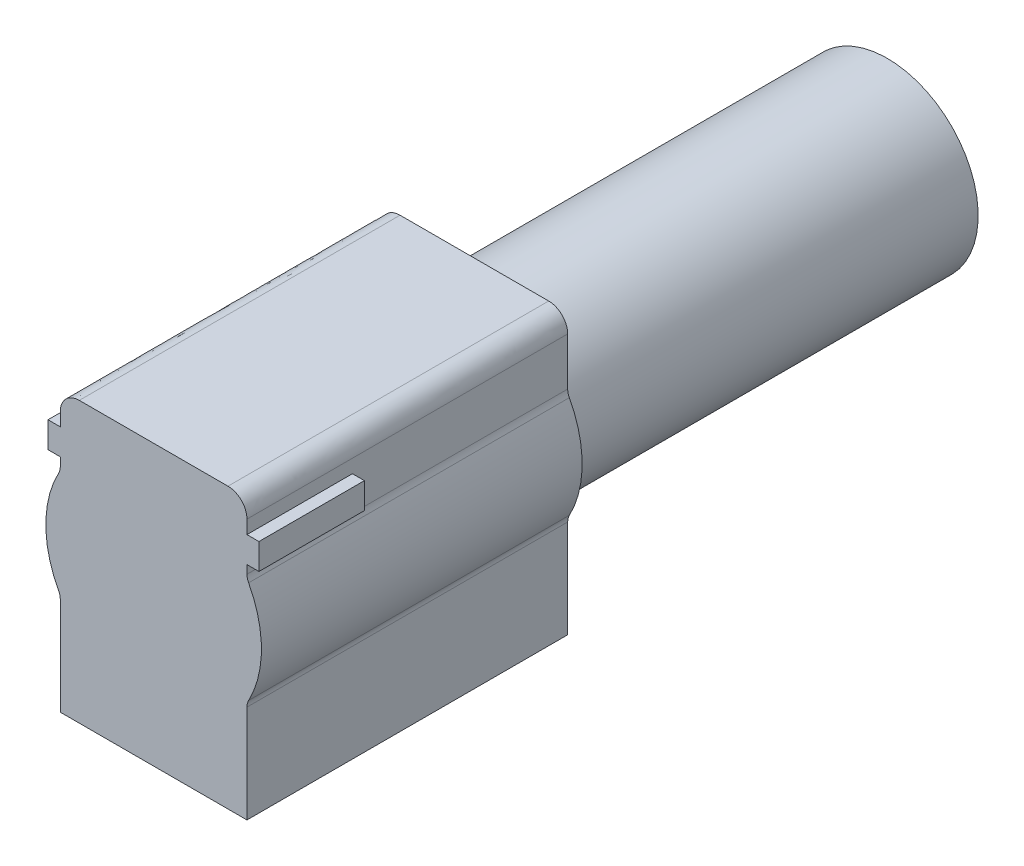
ISO-10303-21;
HEADER;
FILE_DESCRIPTION(('STEP AP214'),'2;1');
FILE_NAME('part.step','',(''),(''),'','','');
FILE_SCHEMA(('AUTOMOTIVE_DESIGN { 1 0 10303 214 1 1 1 1 }'));
ENDSEC;
DATA;
#1=APPLICATION_CONTEXT('core data for automotive mechanical design processes');
#2=APPLICATION_PROTOCOL_DEFINITION('international standard','automotive_design',2000,#1);
#3=PRODUCT_CONTEXT('',#1,'mechanical');
#4=PRODUCT('Part','Part','',(#3));
#5=PRODUCT_RELATED_PRODUCT_CATEGORY('part','',(#4));
#6=PRODUCT_DEFINITION_FORMATION('','',#4);
#7=PRODUCT_DEFINITION_CONTEXT('part definition',#1,'design');
#8=PRODUCT_DEFINITION('design','',#6,#7);
#9=PRODUCT_DEFINITION_SHAPE('','',#8);
#10=(LENGTH_UNIT() NAMED_UNIT(*) SI_UNIT(.MILLI.,.METRE.));
#11=(NAMED_UNIT(*) PLANE_ANGLE_UNIT() SI_UNIT($,.RADIAN.));
#12=(NAMED_UNIT(*) SI_UNIT($,.STERADIAN.) SOLID_ANGLE_UNIT());
#13=UNCERTAINTY_MEASURE_WITH_UNIT(LENGTH_MEASURE(1.E-05),#10,'distance_accuracy_value','');
#14=(GEOMETRIC_REPRESENTATION_CONTEXT(3) GLOBAL_UNCERTAINTY_ASSIGNED_CONTEXT((#13)) GLOBAL_UNIT_ASSIGNED_CONTEXT((#10,
#11,#12)) REPRESENTATION_CONTEXT('',''));
#15=CARTESIAN_POINT('',(0.,0.,0.));
#16=DIRECTION('',(0.,0.,1.));
#17=DIRECTION('',(1.,0.,0.));
#18=AXIS2_PLACEMENT_3D('',#15,#16,#17);
#19=CARTESIAN_POINT('',(-442.305644186328,104.516178530985,-39.53311));
#20=CARTESIAN_POINT('',(-442.305977130678,104.800492867987,-39.53311));
#21=CARTESIAN_POINT('',(-442.235017800684,105.082078518385,-39.53311));
#22=CARTESIAN_POINT('',(-442.100418285104,105.332450282228,-39.53311));
#23=B_SPLINE_CURVE_WITH_KNOTS('',3,(#19,#20,#21,#22),.UNSPECIFIED.,.F.,.F.,(4,4),(0.,
0.999999867875692),.UNSPECIFIED.);
#24=DIRECTION('',(0.,1.17818903998653E-13,1.));
#25=VECTOR('',#24,1.);
#26=SURFACE_OF_LINEAR_EXTRUSION('',#23,#25);
#27=CARTESIAN_POINT('',(-442.100418285104,105.332450282232,0.));
#28=CARTESIAN_POINT('',(-442.235017800684,105.08207851839,0.));
#29=CARTESIAN_POINT('',(-442.305977130678,104.800492867991,0.));
#30=CARTESIAN_POINT('',(-442.305644186327,104.516178530989,0.));
#31=B_SPLINE_CURVE_WITH_KNOTS('',3,(#27,#28,#29,#30),.UNSPECIFIED.,.F.,.F.,(4,4),(0.,
0.999999867875692),.UNSPECIFIED.);
#32=CARTESIAN_POINT('',(-442.305644186327,104.516178530989,0.));
#33=VERTEX_POINT('',#32);
#34=CARTESIAN_POINT('',(-442.100419953928,105.332451050154,-1.11022302462516E-13));
#35=VERTEX_POINT('',#34);
#36=EDGE_CURVE('E446',#33,#35,#31,.F.);
#37=ORIENTED_EDGE('',*,*,#36,.F.);
#38=DIRECTION('',(0.,1.17818903998653E-13,1.));
#39=VECTOR('',#38,1.);
#40=CARTESIAN_POINT('',(-442.305644186328,104.516178530985,-39.53311));
#41=LINE('',#40,#39);
#42=CARTESIAN_POINT('',(-442.305644186328,104.516178530985,-39.53311));
#43=VERTEX_POINT('',#42);
#44=EDGE_CURVE('E52',#43,#33,#41,.T.);
#45=ORIENTED_EDGE('',*,*,#44,.F.);
#46=CARTESIAN_POINT('',(-442.305644186328,104.516178530985,-39.53311));
#47=CARTESIAN_POINT('',(-442.305977130678,104.800492867987,-39.53311));
#48=CARTESIAN_POINT('',(-442.235017800684,105.082078518385,-39.53311));
#49=CARTESIAN_POINT('',(-442.100418285104,105.332450282228,-39.53311));
#50=B_SPLINE_CURVE_WITH_KNOTS('',3,(#46,#47,#48,#49),.UNSPECIFIED.,.F.,.F.,(4,4),(0.,
0.999999867875692),.UNSPECIFIED.);
#51=CARTESIAN_POINT('',(-442.100419953928,105.332451050149,-39.53311));
#52=VERTEX_POINT('',#51);
#53=EDGE_CURVE('E340',#43,#52,#50,.T.);
#54=ORIENTED_EDGE('',*,*,#53,.T.);
#55=DIRECTION('',(0.,1.17818903998653E-13,1.));
#56=VECTOR('',#55,1.);
#57=CARTESIAN_POINT('',(-442.100419953928,105.332451050149,-39.53311));
#58=LINE('',#57,#56);
#59=EDGE_CURVE('E112',#52,#35,#58,.T.);
#60=ORIENTED_EDGE('',*,*,#59,.T.);
#61=EDGE_LOOP('',(#37,#45,#54,#60));
#62=FACE_BOUND('',#61,.T.);
#63=ADVANCED_FACE('F32',(#62),#26,.T.);
#64=CARTESIAN_POINT('',(-442.305703058753,92.4707569211967,-39.5331099999986));
#65=DIRECTION('',(0.999999999988056,-4.88753547257763E-06,0.));
#66=DIRECTION('',(0.,-1.17128107399017E-13,-1.));
#67=AXIS2_PLACEMENT_3D('',#64,#65,#66);
#68=PLANE('',#67);
#69=DIRECTION('',(4.88753547257763E-06,0.999999999988056,-1.19892639432751E-13));
#70=VECTOR('',#69,1.);
#71=CARTESIAN_POINT('',(-442.305703058753,92.4707569212014,1.4432899320127E-12));
#72=LINE('',#71,#70);
#73=CARTESIAN_POINT('',(-442.305703058753,92.4707569212014,1.4432899320127E-12));
#74=VERTEX_POINT('',#73);
#75=EDGE_CURVE('E434',#74,#33,#72,.T.);
#76=ORIENTED_EDGE('',*,*,#75,.F.);
#77=DIRECTION('',(0.,1.17818903998653E-13,1.));
#78=VECTOR('',#77,1.);
#79=CARTESIAN_POINT('',(-442.305703058753,92.4707569211967,-39.5331099999986));
#80=LINE('',#79,#78);
#81=CARTESIAN_POINT('',(-442.305703058753,92.4707569211967,-39.5331099999986));
#82=VERTEX_POINT('',#81);
#83=EDGE_CURVE('E100',#82,#74,#80,.T.);
#84=ORIENTED_EDGE('',*,*,#83,.F.);
#85=DIRECTION('',(4.88753547257763E-06,0.999999999988056,-1.19892639432751E-13));
#86=VECTOR('',#85,1.);
#87=CARTESIAN_POINT('',(-442.305703058753,92.4707569211967,-39.5331099999986));
#88=LINE('',#87,#86);
#89=EDGE_CURVE('E164',#82,#43,#88,.T.);
#90=ORIENTED_EDGE('',*,*,#89,.T.);
#91=ORIENTED_EDGE('',*,*,#44,.T.);
#92=EDGE_LOOP('',(#76,#84,#90,#91));
#93=FACE_BOUND('',#92,.T.);
#94=ADVANCED_FACE('F200',(#93),#68,.T.);
#95=CARTESIAN_POINT('',(-465.314995797592,92.4707569211953,-39.5331099999985));
#96=DIRECTION('',(0.,-1.,1.17818903998652E-13));
#97=DIRECTION('',(-0.707106781186551,-1.27023259789088E-13,-0.707106781186544));
#98=AXIS2_PLACEMENT_3D('',#95,#96,#97);
#99=PLANE('',#98);
#100=DIRECTION('',(1.,0.,0.));
#101=VECTOR('',#100,1.);
#102=CARTESIAN_POINT('',(-465.314995797591,92.4707569212,1.55431223447522E-12));
#103=LINE('',#102,#101);
#104=CARTESIAN_POINT('',(-465.314995797591,92.4707569212,1.55431223447522E-12));
#105=VERTEX_POINT('',#104);
#106=EDGE_CURVE('E151',#105,#74,#103,.T.);
#107=ORIENTED_EDGE('',*,*,#106,.F.);
#108=DIRECTION('',(0.,1.17818903998653E-13,1.));
#109=VECTOR('',#108,1.);
#110=CARTESIAN_POINT('',(-465.314995797592,92.4707569211953,-39.5331099999985));
#111=LINE('',#110,#109);
#112=CARTESIAN_POINT('',(-465.314995797592,92.4707569211953,-39.5331099999985));
#113=VERTEX_POINT('',#112);
#114=EDGE_CURVE('E146',#113,#105,#111,.T.);
#115=ORIENTED_EDGE('',*,*,#114,.F.);
#116=DIRECTION('',(1.,0.,0.));
#117=VECTOR('',#116,1.);
#118=CARTESIAN_POINT('',(-465.314995797592,92.4707569211953,-39.5331099999985));
#119=LINE('',#118,#117);
#120=EDGE_CURVE('E149',#113,#82,#119,.T.);
#121=ORIENTED_EDGE('',*,*,#120,.T.);
#122=ORIENTED_EDGE('',*,*,#83,.T.);
#123=EDGE_LOOP('',(#107,#115,#121,#122));
#124=FACE_BOUND('',#123,.T.);
#125=ADVANCED_FACE('F148',(#124),#99,.T.);
#126=CARTESIAN_POINT('',(-465.315056928932,104.515220681884,-39.5331099999999));
#127=DIRECTION('',(-0.99999999998712,-5.0754721751924E-06,0.));
#128=DIRECTION('',(0.,1.17128107399017E-13,1.));
#129=AXIS2_PLACEMENT_3D('',#126,#127,#128);
#130=PLANE('',#129);
#131=DIRECTION('',(5.0754721751924E-06,-0.99999999998712,1.1712808525269E-13));
#132=VECTOR('',#131,1.);
#133=CARTESIAN_POINT('',(-465.315056928932,104.515220681889,1.11022302462516E-13));
#134=LINE('',#133,#132);
#135=CARTESIAN_POINT('',(-465.315056928932,104.515220681889,1.11022302462516E-13));
#136=VERTEX_POINT('',#135);
#137=EDGE_CURVE('E507',#136,#105,#134,.T.);
#138=ORIENTED_EDGE('',*,*,#137,.F.);
#139=DIRECTION('',(0.,1.17818903998653E-13,1.));
#140=VECTOR('',#139,1.);
#141=CARTESIAN_POINT('',(-465.315056928932,104.515220681884,-39.5331099999999));
#142=LINE('',#141,#140);
#143=CARTESIAN_POINT('',(-465.315056928932,104.515220681884,-39.5331099999999));
#144=VERTEX_POINT('',#143);
#145=EDGE_CURVE('E156',#144,#136,#142,.T.);
#146=ORIENTED_EDGE('',*,*,#145,.F.);
#147=DIRECTION('',(5.0754721751924E-06,-0.99999999998712,1.1712808525269E-13));
#148=VECTOR('',#147,1.);
#149=CARTESIAN_POINT('',(-465.315056928932,104.515220681884,-39.5331099999999));
#150=LINE('',#149,#148);
#151=EDGE_CURVE('E162',#144,#113,#150,.T.);
#152=ORIENTED_EDGE('',*,*,#151,.T.);
#153=ORIENTED_EDGE('',*,*,#114,.T.);
#154=EDGE_LOOP('',(#138,#146,#152,#153));
#155=FACE_BOUND('',#154,.T.);
#156=ADVANCED_FACE('F166',(#155),#130,.T.);
#157=CARTESIAN_POINT('',(-465.519827625904,105.331611216883,-39.5331099999999));
#158=CARTESIAN_POINT('',(-465.385209323518,105.081184567542,-39.5331099999999));
#159=CARTESIAN_POINT('',(-465.314715159667,104.79948061138,-39.5331099999999));
#160=CARTESIAN_POINT('',(-465.315057518886,104.515220605794,-39.5331099999999));
#161=B_SPLINE_CURVE_WITH_KNOTS('',3,(#157,#158,#159,#160),.UNSPECIFIED.,.F.,.F.,(4,4),(0.,
0.999999909930679),.UNSPECIFIED.);
#162=DIRECTION('',(0.,1.17818903998653E-13,1.));
#163=VECTOR('',#162,1.);
#164=SURFACE_OF_LINEAR_EXTRUSION('',#161,#163);
#165=CARTESIAN_POINT('',(-465.315057518886,104.515220605799,0.));
#166=CARTESIAN_POINT('',(-465.314715159667,104.799480611384,0.));
#167=CARTESIAN_POINT('',(-465.385209323518,105.081184567547,0.));
#168=CARTESIAN_POINT('',(-465.519827625904,105.331611216888,0.));
#169=B_SPLINE_CURVE_WITH_KNOTS('',3,(#165,#166,#167,#168),.UNSPECIFIED.,.F.,.F.,(4,4),(0.,
0.999999909930679),.UNSPECIFIED.);
#170=CARTESIAN_POINT('',(-465.519827625904,105.331611216888,1.11022302462516E-13));
#171=VERTEX_POINT('',#170);
#172=EDGE_CURVE('E181',#171,#136,#169,.F.);
#173=ORIENTED_EDGE('',*,*,#172,.F.);
#174=DIRECTION('',(0.,1.17818903998653E-13,1.));
#175=VECTOR('',#174,1.);
#176=CARTESIAN_POINT('',(-465.519827625904,105.331611216883,-39.5331099999999));
#177=LINE('',#176,#175);
#178=CARTESIAN_POINT('',(-465.519827625904,105.331611216883,-39.5331099999999));
#179=VERTEX_POINT('',#178);
#180=EDGE_CURVE('E583',#179,#171,#177,.T.);
#181=ORIENTED_EDGE('',*,*,#180,.F.);
#182=CARTESIAN_POINT('',(-465.519827625904,105.331611216883,-39.5331099999999));
#183=CARTESIAN_POINT('',(-465.385209323518,105.081184567542,-39.5331099999999));
#184=CARTESIAN_POINT('',(-465.314715159667,104.79948061138,-39.5331099999999));
#185=CARTESIAN_POINT('',(-465.315057518886,104.515220605794,-39.5331099999999));
#186=B_SPLINE_CURVE_WITH_KNOTS('',3,(#182,#183,#184,#185),.UNSPECIFIED.,.F.,.F.,(4,4),(0.,
0.999999909930679),.UNSPECIFIED.);
#187=EDGE_CURVE('E167',#179,#144,#186,.T.);
#188=ORIENTED_EDGE('',*,*,#187,.T.);
#189=ORIENTED_EDGE('',*,*,#145,.T.);
#190=EDGE_LOOP('',(#173,#181,#188,#189));
#191=FACE_BOUND('',#190,.T.);
#192=ADVANCED_FACE('F520',(#191),#164,.T.);
#193=CARTESIAN_POINT('',(-453.810349453975,111.609532937296,-39.5331100000007));
#194=DIRECTION('',(0.,1.17818903998653E-13,1.));
#195=DIRECTION('',(1.,0.,0.));
#196=AXIS2_PLACEMENT_3D('',#193,#194,#195);
#197=CYLINDRICAL_SURFACE('',#196,13.2862412259459);
#198=CARTESIAN_POINT('',(-453.810349453975,111.609532937301,-7.7715611723761E-13));
#199=DIRECTION('',(0.,1.17818903998653E-13,1.));
#200=DIRECTION('',(1.,0.,0.));
#201=AXIS2_PLACEMENT_3D('',#198,#199,#200);
#202=CIRCLE('',#201,13.2862412259459);
#203=CARTESIAN_POINT('',(-465.520278954022,117.886614824448,-1.4432899320127E-12));
#204=VERTEX_POINT('',#203);
#205=EDGE_CURVE('E421',#204,#171,#202,.T.);
#206=ORIENTED_EDGE('',*,*,#205,.F.);
#207=DIRECTION('',(0.,1.17818903998653E-13,1.));
#208=VECTOR('',#207,1.);
#209=CARTESIAN_POINT('',(-465.520278954022,117.886614824443,-39.5331100000015));
#210=LINE('',#209,#208);
#211=CARTESIAN_POINT('',(-465.520278954022,117.886614824443,-39.5331100000015));
#212=VERTEX_POINT('',#211);
#213=EDGE_CURVE('E576',#212,#204,#210,.T.);
#214=ORIENTED_EDGE('',*,*,#213,.F.);
#215=CARTESIAN_POINT('',(-453.810349453975,111.609532937296,-39.5331100000007));
#216=DIRECTION('',(0.,1.17818903998653E-13,1.));
#217=DIRECTION('',(1.,0.,0.));
#218=AXIS2_PLACEMENT_3D('',#215,#216,#217);
#219=CIRCLE('',#218,13.2862412259459);
#220=EDGE_CURVE('E169',#212,#179,#219,.T.);
#221=ORIENTED_EDGE('',*,*,#220,.T.);
#222=ORIENTED_EDGE('',*,*,#180,.T.);
#223=EDGE_LOOP('',(#206,#214,#221,#222));
#224=FACE_BOUND('',#223,.T.);
#225=ADVANCED_FACE('F530',(#224),#197,.T.);
#226=CARTESIAN_POINT('',(-465.315054721622,118.702887343609,-39.5331100000015));
#227=CARTESIAN_POINT('',(-465.314721777271,118.418573006607,-39.5331100000016));
#228=CARTESIAN_POINT('',(-465.385681107265,118.136987356208,-39.5331100000015));
#229=CARTESIAN_POINT('',(-465.520280622845,117.886615592365,-39.5331100000015));
#230=B_SPLINE_CURVE_WITH_KNOTS('',3,(#226,#227,#228,#229),.UNSPECIFIED.,.F.,.F.,(4,4),(0.,
0.999999867896139),.UNSPECIFIED.);
#231=DIRECTION('',(0.,1.17818903998653E-13,1.));
#232=VECTOR('',#231,1.);
#233=SURFACE_OF_LINEAR_EXTRUSION('',#230,#232);
#234=CARTESIAN_POINT('',(-465.520280622845,117.886615592369,-1.45022882591661E-12));
#235=CARTESIAN_POINT('',(-465.385681107265,118.136987356213,-1.45022882591661E-12));
#236=CARTESIAN_POINT('',(-465.314721777271,118.418573006611,-1.56125112837913E-12));
#237=CARTESIAN_POINT('',(-465.315054721622,118.702887343614,-1.45022882591661E-12));
#238=B_SPLINE_CURVE_WITH_KNOTS('',3,(#234,#235,#236,#237),.UNSPECIFIED.,.F.,.F.,(4,4),(0.,
0.999999867896139),.UNSPECIFIED.);
#239=CARTESIAN_POINT('',(-465.315054721622,118.702887343614,-1.55431223447522E-12));
#240=VERTEX_POINT('',#239);
#241=EDGE_CURVE('E418',#240,#204,#238,.F.);
#242=ORIENTED_EDGE('',*,*,#241,.F.);
#243=DIRECTION('',(0.,1.17818903998653E-13,1.));
#244=VECTOR('',#243,1.);
#245=CARTESIAN_POINT('',(-465.315054721622,118.702887343609,-39.5331100000015));
#246=LINE('',#245,#244);
#247=CARTESIAN_POINT('',(-465.315054721622,118.702887343609,-39.5331100000015));
#248=VERTEX_POINT('',#247);
#249=EDGE_CURVE('E399',#248,#240,#246,.T.);
#250=ORIENTED_EDGE('',*,*,#249,.F.);
#251=CARTESIAN_POINT('',(-465.315054721622,118.702887343609,-39.5331100000015));
#252=CARTESIAN_POINT('',(-465.314721777271,118.418573006607,-39.5331100000016));
#253=CARTESIAN_POINT('',(-465.385681107265,118.136987356208,-39.5331100000015));
#254=CARTESIAN_POINT('',(-465.520280622845,117.886615592365,-39.5331100000015));
#255=B_SPLINE_CURVE_WITH_KNOTS('',3,(#251,#252,#253,#254),.UNSPECIFIED.,.F.,.F.,(4,4),(0.,
0.999999867896139),.UNSPECIFIED.);
#256=EDGE_CURVE('E565',#248,#212,#255,.T.);
#257=ORIENTED_EDGE('',*,*,#256,.T.);
#258=ORIENTED_EDGE('',*,*,#213,.T.);
#259=EDGE_LOOP('',(#242,#250,#257,#258));
#260=FACE_BOUND('',#259,.T.);
#261=ADVANCED_FACE('F544',(#260),#233,.T.);
#262=CARTESIAN_POINT('',(-465.315051966971,124.5908932709,-39.5331100000023));
#263=DIRECTION('',(-0.999999999999891,4.67841037362484E-07,0.));
#264=DIRECTION('',(0.,1.17128107399017E-13,1.));
#265=AXIS2_PLACEMENT_3D('',#262,#263,#264);
#266=PLANE('',#265);
#267=DIRECTION('',(0.,0.,-1.));
#268=VECTOR('',#267,1.);
#269=CARTESIAN_POINT('',(-465.315052742384,122.933466311507,-39.5331100000023));
#270=LINE('',#269,#268);
#271=CARTESIAN_POINT('',(-465.315052742383,122.933466311507,-4.44089209850063E-13));
#272=VERTEX_POINT('',#271);
#273=CARTESIAN_POINT('',(-465.315053373969,122.933466311507,-13.0000000000005));
#274=VERTEX_POINT('',#273);
#275=EDGE_CURVE('E417',#272,#274,#270,.T.);
#276=ORIENTED_EDGE('',*,*,#275,.F.);
#277=DIRECTION('',(-4.67841037362484E-07,-0.999999999999891,1.17128109472538E-13));
#278=VECTOR('',#277,1.);
#279=CARTESIAN_POINT('',(-465.315051966971,124.590893270905,-2.22044604925031E-12));
#280=LINE('',#279,#278);
#281=CARTESIAN_POINT('',(-465.315051966971,124.590893270905,-2.22044604925031E-12));
#282=VERTEX_POINT('',#281);
#283=EDGE_CURVE('E405',#282,#272,#280,.T.);
#284=ORIENTED_EDGE('',*,*,#283,.F.);
#285=DIRECTION('',(0.,1.17818903998653E-13,1.));
#286=VECTOR('',#285,1.);
#287=CARTESIAN_POINT('',(-465.315051966971,124.5908932709,-39.5331100000023));
#288=LINE('',#287,#286);
#289=CARTESIAN_POINT('',(-465.315051966971,124.5908932709,-39.5331100000023));
#290=VERTEX_POINT('',#289);
#291=EDGE_CURVE('E397',#290,#282,#288,.T.);
#292=ORIENTED_EDGE('',*,*,#291,.F.);
#293=DIRECTION('',(-4.67841037362484E-07,-0.999999999999891,1.17128109472538E-13));
#294=VECTOR('',#293,1.);
#295=CARTESIAN_POINT('',(-465.315051966971,124.5908932709,-39.5331100000023));
#296=LINE('',#295,#294);
#297=EDGE_CURVE('E390',#290,#248,#296,.T.);
#298=ORIENTED_EDGE('',*,*,#297,.T.);
#299=ORIENTED_EDGE('',*,*,#249,.T.);
#300=CARTESIAN_POINT('',(-465.315054239475,119.733466311507,-4.44089209850063E-13));
#301=VERTEX_POINT('',#300);
#302=EDGE_CURVE('E375',#301,#240,#280,.T.);
#303=ORIENTED_EDGE('',*,*,#302,.F.);
#304=DIRECTION('',(0.,0.,1.));
#305=VECTOR('',#304,1.);
#306=CARTESIAN_POINT('',(-465.315054239475,119.733466311507,-39.5331100000024));
#307=LINE('',#306,#305);
#308=CARTESIAN_POINT('',(-465.315054239475,119.733466311507,-13.0000000000005));
#309=VERTEX_POINT('',#308);
#310=EDGE_CURVE('E489',#309,#301,#307,.T.);
#311=ORIENTED_EDGE('',*,*,#310,.F.);
#312=DIRECTION('',(4.67841037362484E-07,0.999999999999891,0.));
#313=VECTOR('',#312,1.);
#314=CARTESIAN_POINT('',(-465.315051966971,124.5908932709,-13.0000000000003));
#315=LINE('',#314,#313);
#316=EDGE_CURVE('E485',#309,#274,#315,.T.);
#317=ORIENTED_EDGE('',*,*,#316,.T.);
#318=EDGE_LOOP('',(#276,#284,#292,#298,#299,#303,#311,#317));
#319=FACE_BOUND('',#318,.T.);
#320=ADVANCED_FACE('F414',(#319),#266,.T.);
#321=CARTESIAN_POINT('',(-462.970081576699,126.931812454707,-39.5331100000026));
#322=CARTESIAN_POINT('',(-463.279468852035,126.931600039077,-39.5331100000025));
#323=CARTESIAN_POINT('',(-463.583388996171,126.872071869415,-39.5331100000026));
#324=CARTESIAN_POINT('',(-464.151055886368,126.637562427129,-39.5331100000025));
#325=CARTESIAN_POINT('',(-464.41109404816,126.463966036737,-39.5331100000025));
#326=CARTESIAN_POINT('',(-465.060345435032,125.816673430633,-39.5331100000023));
#327=CARTESIAN_POINT('',(-465.315330810394,125.209920549047,-39.5331100000023));
#328=CARTESIAN_POINT('',(-465.315048564472,124.5908932725,-39.5331100000023));
#329=B_SPLINE_CURVE_WITH_KNOTS('',3,(#321,#322,#323,#324,#325,#326,#327,#328),.UNSPECIFIED.,.F.,
.F.,(4,2,2,4),(0.,0.250000000000005,0.50000000000001,1.),.UNSPECIFIED.);
#330=DIRECTION('',(0.,1.17818903998653E-13,1.));
#331=VECTOR('',#330,1.);
#332=SURFACE_OF_LINEAR_EXTRUSION('',#329,#331);
#333=CARTESIAN_POINT('',(-465.315048564472,124.590893272505,-2.31065167000111E-12));
#334=CARTESIAN_POINT('',(-465.315330810393,125.209920549052,-2.31065167000111E-12));
#335=CARTESIAN_POINT('',(-465.060345435032,125.816673430638,-2.31065167000111E-12));
#336=CARTESIAN_POINT('',(-464.41109404816,126.463966036741,-2.53269627492614E-12));
#337=CARTESIAN_POINT('',(-464.151055886368,126.637562427134,-2.53269627492614E-12));
#338=CARTESIAN_POINT('',(-463.583388996171,126.87207186942,-2.64371857738865E-12));
#339=CARTESIAN_POINT('',(-463.279468852035,126.931600039082,-2.53269627492614E-12));
#340=CARTESIAN_POINT('',(-462.970081576698,126.931812454712,-2.64371857738865E-12));
#341=B_SPLINE_CURVE_WITH_KNOTS('',3,(#333,#334,#335,#336,#337,#338,#339,#340),.UNSPECIFIED.,.F.,
.F.,(4,2,2,4),(0.,0.49999999999999,0.749999999999995,1.),.UNSPECIFIED.);
#342=CARTESIAN_POINT('',(-462.970081576698,126.931812454712,-2.66453525910038E-12));
#343=VERTEX_POINT('',#342);
#344=EDGE_CURVE('E373',#343,#282,#341,.F.);
#345=ORIENTED_EDGE('',*,*,#344,.F.);
#346=DIRECTION('',(0.,1.17818903998653E-13,1.));
#347=VECTOR('',#346,1.);
#348=CARTESIAN_POINT('',(-462.970081576699,126.931812454707,-39.5331100000026));
#349=LINE('',#348,#347);
#350=CARTESIAN_POINT('',(-462.970081576699,126.931812454707,-39.5331100000026));
#351=VERTEX_POINT('',#350);
#352=EDGE_CURVE('E352',#351,#343,#349,.T.);
#353=ORIENTED_EDGE('',*,*,#352,.F.);
#354=CARTESIAN_POINT('',(-462.970081576699,126.931812454707,-39.5331100000026));
#355=CARTESIAN_POINT('',(-463.279468852035,126.931600039077,-39.5331100000025));
#356=CARTESIAN_POINT('',(-463.583388996171,126.872071869415,-39.5331100000026));
#357=CARTESIAN_POINT('',(-464.151055886368,126.637562427129,-39.5331100000025));
#358=CARTESIAN_POINT('',(-464.41109404816,126.463966036737,-39.5331100000025));
#359=CARTESIAN_POINT('',(-465.060345435032,125.816673430633,-39.5331100000023));
#360=CARTESIAN_POINT('',(-465.315330810394,125.209920549047,-39.5331100000023));
#361=CARTESIAN_POINT('',(-465.315048564472,124.5908932725,-39.5331100000023));
#362=B_SPLINE_CURVE_WITH_KNOTS('',3,(#354,#355,#356,#357,#358,#359,#360,#361),.UNSPECIFIED.,.F.,
.F.,(4,2,2,4),(0.,0.250000000000005,0.50000000000001,1.),.UNSPECIFIED.);
#363=EDGE_CURVE('E386',#351,#290,#362,.T.);
#364=ORIENTED_EDGE('',*,*,#363,.T.);
#365=ORIENTED_EDGE('',*,*,#291,.T.);
#366=EDGE_LOOP('',(#345,#353,#364,#365));
#367=FACE_BOUND('',#366,.T.);
#368=ADVANCED_FACE('F407',(#367),#332,.T.);
#369=CARTESIAN_POINT('',(-444.646564646967,126.93181107318,-39.5331100000026));
#370=DIRECTION('',(7.53963979488601E-08,0.999999999999997,-1.1781890437364E-13));
#371=DIRECTION('',(-0.707106781186544,5.33133875772246E-08,0.70710678118655));
#372=AXIS2_PLACEMENT_3D('',#369,#370,#371);
#373=PLANE('',#372);
#374=DIRECTION('',(-0.999999999999997,7.53963979488601E-08,0.));
#375=VECTOR('',#374,1.);
#376=CARTESIAN_POINT('',(-444.646564646966,126.931811073185,-2.55351295663786E-12));
#377=LINE('',#376,#375);
#378=CARTESIAN_POINT('',(-444.646564646966,126.931811073185,-2.55351295663786E-12));
#379=VERTEX_POINT('',#378);
#380=EDGE_CURVE('E371',#379,#343,#377,.T.);
#381=ORIENTED_EDGE('',*,*,#380,.F.);
#382=DIRECTION('',(0.,1.17818903998653E-13,1.));
#383=VECTOR('',#382,1.);
#384=CARTESIAN_POINT('',(-444.646564646967,126.93181107318,-39.5331100000026));
#385=LINE('',#384,#383);
#386=CARTESIAN_POINT('',(-444.646564646967,126.93181107318,-39.5331100000026));
#387=VERTEX_POINT('',#386);
#388=EDGE_CURVE('E347',#387,#379,#385,.T.);
#389=ORIENTED_EDGE('',*,*,#388,.F.);
#390=DIRECTION('',(-0.999999999999997,7.53963979488601E-08,0.));
#391=VECTOR('',#390,1.);
#392=CARTESIAN_POINT('',(-444.646564646967,126.93181107318,-39.5331100000026));
#393=LINE('',#392,#391);
#394=EDGE_CURVE('E384',#387,#351,#393,.T.);
#395=ORIENTED_EDGE('',*,*,#394,.T.);
#396=ORIENTED_EDGE('',*,*,#352,.T.);
#397=EDGE_LOOP('',(#381,#389,#395,#396));
#398=FACE_BOUND('',#397,.T.);
#399=ADVANCED_FACE('F287',(#398),#373,.T.);
#400=CARTESIAN_POINT('',(-442.305646124485,124.588570288248,-39.5331100000024));
#401=CARTESIAN_POINT('',(-442.305858463457,124.897845916206,-39.5331100000024));
#402=CARTESIAN_POINT('',(-442.36578649934,125.201572162842,-39.5331100000025));
#403=CARTESIAN_POINT('',(-442.600497033674,125.76881577308,-39.5331100000025));
#404=CARTESIAN_POINT('',(-442.774149386848,126.028677898942,-39.5331100000025));
#405=CARTESIAN_POINT('',(-443.421345627307,126.677335876201,-39.5331100000025));
#406=CARTESIAN_POINT('',(-444.027836861555,126.932089161987,-39.5331100000027));
#407=CARTESIAN_POINT('',(-444.646564645081,126.931807047553,-39.5331100000026));
#408=B_SPLINE_CURVE_WITH_KNOTS('',3,(#400,#401,#402,#403,#404,#405,#406,#407),.UNSPECIFIED.,.F.,
.F.,(4,2,2,4),(0.,0.249999999999998,0.499999999999997,1.),.UNSPECIFIED.);
#409=DIRECTION('',(0.,1.17818903998653E-13,1.));
#410=VECTOR('',#409,1.);
#411=SURFACE_OF_LINEAR_EXTRUSION('',#408,#410);
#412=CARTESIAN_POINT('',(-444.64656464508,126.931807047558,-2.5951463200613E-12));
#413=CARTESIAN_POINT('',(-444.027836861554,126.932089161991,-2.70616862252382E-12));
#414=CARTESIAN_POINT('',(-443.421345627307,126.677335876206,-2.48412401759879E-12));
#415=CARTESIAN_POINT('',(-442.774149386848,126.028677898947,-2.48412401759879E-12));
#416=CARTESIAN_POINT('',(-442.600497033673,125.768815773085,-2.48412401759879E-12));
#417=CARTESIAN_POINT('',(-442.365786499339,125.201572162846,-2.48412401759879E-12));
#418=CARTESIAN_POINT('',(-442.305858463457,124.89784591621,-2.37310171513627E-12));
#419=CARTESIAN_POINT('',(-442.305646124485,124.588570288252,-2.37310171513627E-12));
#420=B_SPLINE_CURVE_WITH_KNOTS('',3,(#412,#413,#414,#415,#416,#417,#418,#419),.UNSPECIFIED.,.F.,
.F.,(4,2,2,4),(0.,0.500000000000003,0.750000000000002,1.),.UNSPECIFIED.);
#421=CARTESIAN_POINT('',(-442.305646124485,124.588570288252,-2.33146835171283E-12));
#422=VERTEX_POINT('',#421);
#423=EDGE_CURVE('E308',#422,#379,#420,.F.);
#424=ORIENTED_EDGE('',*,*,#423,.F.);
#425=DIRECTION('',(0.,1.17818903998653E-13,1.));
#426=VECTOR('',#425,1.);
#427=CARTESIAN_POINT('',(-442.305646124485,124.588570288248,-39.5331100000024));
#428=LINE('',#427,#426);
#429=CARTESIAN_POINT('',(-442.305646124485,124.588570288248,-39.5331100000024));
#430=VERTEX_POINT('',#429);
#431=EDGE_CURVE('E343',#430,#422,#428,.T.);
#432=ORIENTED_EDGE('',*,*,#431,.F.);
#433=CARTESIAN_POINT('',(-442.305646124485,124.588570288248,-39.5331100000024));
#434=CARTESIAN_POINT('',(-442.305858463457,124.897845916206,-39.5331100000024));
#435=CARTESIAN_POINT('',(-442.36578649934,125.201572162842,-39.5331100000025));
#436=CARTESIAN_POINT('',(-442.600497033674,125.76881577308,-39.5331100000025));
#437=CARTESIAN_POINT('',(-442.774149386848,126.028677898942,-39.5331100000025));
#438=CARTESIAN_POINT('',(-443.421345627307,126.677335876201,-39.5331100000025));
#439=CARTESIAN_POINT('',(-444.027836861555,126.932089161987,-39.5331100000027));
#440=CARTESIAN_POINT('',(-444.646564645081,126.931807047553,-39.5331100000026));
#441=B_SPLINE_CURVE_WITH_KNOTS('',3,(#433,#434,#435,#436,#437,#438,#439,#440),.UNSPECIFIED.,.F.,
.F.,(4,2,2,4),(0.,0.249999999999998,0.499999999999997,1.),.UNSPECIFIED.);
#442=EDGE_CURVE('E362',#430,#387,#441,.T.);
#443=ORIENTED_EDGE('',*,*,#442,.T.);
#444=ORIENTED_EDGE('',*,*,#388,.T.);
#445=EDGE_LOOP('',(#424,#432,#443,#444));
#446=FACE_BOUND('',#445,.T.);
#447=ADVANCED_FACE('F283',(#446),#411,.T.);
#448=CARTESIAN_POINT('',(-442.305641979007,118.703841632795,-39.5331100000016));
#449=DIRECTION('',(0.999999999999752,7.04446682535989E-07,0.));
#450=DIRECTION('',(0.,-1.17128107399017E-13,-1.));
#451=AXIS2_PLACEMENT_3D('',#448,#449,#450);
#452=PLANE('',#451);
#453=DIRECTION('',(0.,0.,1.));
#454=VECTOR('',#453,1.);
#455=CARTESIAN_POINT('',(-442.305644958553,122.933466311511,-39.5331100000016));
#456=LINE('',#455,#454);
#457=CARTESIAN_POINT('',(-442.305644007549,122.933466311511,-13.0000000000003));
#458=VERTEX_POINT('',#457);
#459=CARTESIAN_POINT('',(-442.305644958552,122.933466311511,-4.44089209850063E-13));
#460=VERTEX_POINT('',#459);
#461=EDGE_CURVE('E800',#458,#460,#456,.T.);
#462=ORIENTED_EDGE('',*,*,#461,.F.);
#463=DIRECTION('',(7.0444668253599E-07,-0.999999999999752,0.));
#464=VECTOR('',#463,1.);
#465=CARTESIAN_POINT('',(-442.305641979007,118.703841632795,-13.0000000000003));
#466=LINE('',#465,#464);
#467=CARTESIAN_POINT('',(-442.305642704323,119.733466311511,-13.0000000000003));
#468=VERTEX_POINT('',#467);
#469=EDGE_CURVE('E11',#458,#468,#466,.T.);
#470=ORIENTED_EDGE('',*,*,#469,.T.);
#471=DIRECTION('',(0.,0.,-1.));
#472=VECTOR('',#471,1.);
#473=CARTESIAN_POINT('',(-442.305642704323,119.733466311511,-39.5331100000017));
#474=LINE('',#473,#472);
#475=CARTESIAN_POINT('',(-442.305642704323,119.733466311511,-4.44089209850063E-13));
#476=VERTEX_POINT('',#475);
#477=EDGE_CURVE('E844',#476,#468,#474,.T.);
#478=ORIENTED_EDGE('',*,*,#477,.F.);
#479=DIRECTION('',(-7.04446682535989E-07,0.999999999999752,-1.11469440990976E-13));
#480=VECTOR('',#479,1.);
#481=CARTESIAN_POINT('',(-442.305641979007,118.7038416328,-1.66533453693773E-12));
#482=LINE('',#481,#480);
#483=CARTESIAN_POINT('',(-442.305641979007,118.7038416328,-1.66533453693773E-12));
#484=VERTEX_POINT('',#483);
#485=EDGE_CURVE('E301',#484,#476,#482,.T.);
#486=ORIENTED_EDGE('',*,*,#485,.F.);
#487=DIRECTION('',(0.,1.17818903998653E-13,1.));
#488=VECTOR('',#487,1.);
#489=CARTESIAN_POINT('',(-442.305641979007,118.703841632795,-39.5331100000016));
#490=LINE('',#489,#488);
#491=CARTESIAN_POINT('',(-442.305641979007,118.703841632795,-39.5331100000016));
#492=VERTEX_POINT('',#491);
#493=EDGE_CURVE('E335',#492,#484,#490,.T.);
#494=ORIENTED_EDGE('',*,*,#493,.F.);
#495=DIRECTION('',(-7.04446682535989E-07,0.999999999999752,-1.11469440990976E-13));
#496=VECTOR('',#495,1.);
#497=CARTESIAN_POINT('',(-442.305641979007,118.703841632795,-39.5331100000016));
#498=LINE('',#497,#496);
#499=EDGE_CURVE('E360',#492,#430,#498,.T.);
#500=ORIENTED_EDGE('',*,*,#499,.T.);
#501=ORIENTED_EDGE('',*,*,#431,.T.);
#502=EDGE_CURVE('E37',#460,#422,#482,.T.);
#503=ORIENTED_EDGE('',*,*,#502,.F.);
#504=EDGE_LOOP('',(#462,#470,#478,#486,#494,#500,#501,#503));
#505=FACE_BOUND('',#504,.T.);
#506=ADVANCED_FACE('F257',(#505),#452,.T.);
#507=CARTESIAN_POINT('',(-442.100871282046,117.88745465771,-39.5331100000016));
#508=CARTESIAN_POINT('',(-442.235489017325,118.137880252077,-39.5331100000016));
#509=CARTESIAN_POINT('',(-442.305983751167,118.419582861065,-39.5331100000016));
#510=CARTESIAN_POINT('',(-442.305641393352,118.703841708332,-39.5331100000016));
#511=B_SPLINE_CURVE_WITH_KNOTS('',3,(#507,#508,#509,#510),.UNSPECIFIED.,.F.,.F.,(4,4),(0.,
0.999999910707361),.UNSPECIFIED.);
#512=DIRECTION('',(0.,1.17818903998653E-13,1.));
#513=VECTOR('',#512,1.);
#514=SURFACE_OF_LINEAR_EXTRUSION('',#511,#513);
#515=CARTESIAN_POINT('',(-442.305641393352,118.703841708337,-1.56125112837913E-12));
#516=CARTESIAN_POINT('',(-442.305983751167,118.41958286107,-1.56125112837913E-12));
#517=CARTESIAN_POINT('',(-442.235489017324,118.137880252082,-1.56125112837913E-12));
#518=CARTESIAN_POINT('',(-442.100871282046,117.887454657714,-1.56125112837913E-12));
#519=B_SPLINE_CURVE_WITH_KNOTS('',3,(#515,#516,#517,#518),.UNSPECIFIED.,.F.,.F.,(4,4),(0.,
0.999999910707361),.UNSPECIFIED.);
#520=CARTESIAN_POINT('',(-442.100871282046,117.887454657714,-1.55431223447522E-12));
#521=VERTEX_POINT('',#520);
#522=EDGE_CURVE('E238',#521,#484,#519,.F.);
#523=ORIENTED_EDGE('',*,*,#522,.F.);
#524=DIRECTION('',(0.,1.17818903998653E-13,1.));
#525=VECTOR('',#524,1.);
#526=CARTESIAN_POINT('',(-442.100871282046,117.88745465771,-39.5331100000016));
#527=LINE('',#526,#525);
#528=CARTESIAN_POINT('',(-442.100871282046,117.88745465771,-39.5331100000016));
#529=VERTEX_POINT('',#528);
#530=EDGE_CURVE('E328',#529,#521,#527,.T.);
#531=ORIENTED_EDGE('',*,*,#530,.F.);
#532=CARTESIAN_POINT('',(-442.100871282046,117.88745465771,-39.5331100000016));
#533=CARTESIAN_POINT('',(-442.235489017325,118.137880252077,-39.5331100000016));
#534=CARTESIAN_POINT('',(-442.305983751167,118.419582861065,-39.5331100000016));
#535=CARTESIAN_POINT('',(-442.305641393352,118.703841708332,-39.5331100000016));
#536=B_SPLINE_CURVE_WITH_KNOTS('',3,(#532,#533,#534,#535),.UNSPECIFIED.,.F.,.F.,(4,4),(0.,
0.999999910707361),.UNSPECIFIED.);
#537=EDGE_CURVE('E314',#529,#492,#536,.T.);
#538=ORIENTED_EDGE('',*,*,#537,.T.);
#539=ORIENTED_EDGE('',*,*,#493,.T.);
#540=EDGE_LOOP('',(#523,#531,#538,#539));
#541=FACE_BOUND('',#540,.T.);
#542=ADVANCED_FACE('F246',(#541),#514,.T.);
#543=CARTESIAN_POINT('',(-453.810349453975,111.609532937296,-39.5331100000007));
#544=DIRECTION('',(0.,1.17818903998653E-13,1.));
#545=DIRECTION('',(1.,0.,0.));
#546=AXIS2_PLACEMENT_3D('',#543,#544,#545);
#547=CYLINDRICAL_SURFACE('',#546,13.2862412259458);
#548=CARTESIAN_POINT('',(-453.810349453975,111.609532937301,-7.7715611723761E-13));
#549=DIRECTION('',(0.,1.17818903998653E-13,1.));
#550=DIRECTION('',(1.,0.,0.));
#551=AXIS2_PLACEMENT_3D('',#548,#549,#550);
#552=CIRCLE('',#551,13.2862412259458);
#553=EDGE_CURVE('E244',#35,#521,#552,.T.);
#554=ORIENTED_EDGE('',*,*,#553,.F.);
#555=ORIENTED_EDGE('',*,*,#59,.F.);
#556=CARTESIAN_POINT('',(-453.810349453975,111.609532937296,-39.5331100000007));
#557=DIRECTION('',(0.,1.17818903998653E-13,1.));
#558=DIRECTION('',(1.,0.,0.));
#559=AXIS2_PLACEMENT_3D('',#556,#557,#558);
#560=CIRCLE('',#559,13.2862412259458);
#561=EDGE_CURVE('E338',#52,#529,#560,.T.);
#562=ORIENTED_EDGE('',*,*,#561,.T.);
#563=ORIENTED_EDGE('',*,*,#530,.T.);
#564=EDGE_LOOP('',(#554,#555,#562,#563));
#565=FACE_BOUND('',#564,.T.);
#566=ADVANCED_FACE('F256',(#565),#547,.T.);
#567=CARTESIAN_POINT('',(-442.25363090819,104.937042871541,-39.53311));
#568=DIRECTION('',(0.,0.,1.));
#569=DIRECTION('',(1.,0.,0.));
#570=AXIS2_PLACEMENT_3D('',#567,#568,#569);
#571=PLANE('',#570);
#572=CARTESIAN_POINT('',(-453.810349453976,111.609532937269,-39.53311));
#573=DIRECTION('',(0.,0.,-1.));
#574=DIRECTION('',(-1.,0.,0.));
#575=AXIS2_PLACEMENT_3D('',#572,#573,#574);
#576=CIRCLE('',#575,11.19822);
#577=CARTESIAN_POINT('',(-465.008569453976,111.609532937269,-39.53311));
#578=VERTEX_POINT('',#577);
#579=EDGE_CURVE('E44',#578,#578,#576,.T.);
#580=ORIENTED_EDGE('',*,*,#579,.F.);
#581=EDGE_LOOP('',(#580));
#582=FACE_BOUND('',#581,.T.);
#583=ORIENTED_EDGE('',*,*,#53,.F.);
#584=ORIENTED_EDGE('',*,*,#89,.F.);
#585=ORIENTED_EDGE('',*,*,#120,.F.);
#586=ORIENTED_EDGE('',*,*,#151,.F.);
#587=ORIENTED_EDGE('',*,*,#187,.F.);
#588=ORIENTED_EDGE('',*,*,#220,.F.);
#589=ORIENTED_EDGE('',*,*,#256,.F.);
#590=ORIENTED_EDGE('',*,*,#297,.F.);
#591=ORIENTED_EDGE('',*,*,#363,.F.);
#592=ORIENTED_EDGE('',*,*,#394,.F.);
#593=ORIENTED_EDGE('',*,*,#442,.F.);
#594=ORIENTED_EDGE('',*,*,#499,.F.);
#595=ORIENTED_EDGE('',*,*,#537,.F.);
#596=ORIENTED_EDGE('',*,*,#561,.F.);
#597=EDGE_LOOP('',(#583,#584,#585,#586,#587,#588,#589,#590,#591,#592,#593,#594,#595,#596));
#598=FACE_BOUND('',#597,.T.);
#599=ADVANCED_FACE('F160',(#582,#598),#571,.F.);
#600=CARTESIAN_POINT('',(-442.25363090819,104.937042871546,0.));
#601=DIRECTION('',(0.,0.,1.));
#602=DIRECTION('',(1.,0.,0.));
#603=AXIS2_PLACEMENT_3D('',#600,#601,#602);
#604=PLANE('',#603);
#605=ORIENTED_EDGE('',*,*,#283,.T.);
#606=DIRECTION('',(-1.,-1.6594306421772E-13,0.));
#607=VECTOR('',#606,1.);
#608=CARTESIAN_POINT('',(-466.829182600555,122.933466311507,-4.44089209850063E-13));
#609=LINE('',#608,#607);
#610=CARTESIAN_POINT('',(-466.829182600555,122.933466311507,-4.44089209850063E-13));
#611=VERTEX_POINT('',#610);
#612=EDGE_CURVE('E877',#272,#611,#609,.T.);
#613=ORIENTED_EDGE('',*,*,#612,.T.);
#614=DIRECTION('',(-1.6594306421772E-13,1.,0.));
#615=VECTOR('',#614,1.);
#616=CARTESIAN_POINT('',(-466.829182600555,119.733466311507,-4.44089209850063E-13));
#617=LINE('',#616,#615);
#618=CARTESIAN_POINT('',(-466.829182600555,119.733466311507,-4.44089209850063E-13));
#619=VERTEX_POINT('',#618);
#620=EDGE_CURVE('E838',#619,#611,#617,.T.);
#621=ORIENTED_EDGE('',*,*,#620,.F.);
#622=DIRECTION('',(-1.,-1.6594306421772E-13,0.));
#623=VECTOR('',#622,1.);
#624=CARTESIAN_POINT('',(-440.829182600555,119.733466311511,-4.44089209850063E-13));
#625=LINE('',#624,#623);
#626=EDGE_CURVE('E821',#301,#619,#625,.T.);
#627=ORIENTED_EDGE('',*,*,#626,.F.);
#628=ORIENTED_EDGE('',*,*,#302,.T.);
#629=ORIENTED_EDGE('',*,*,#241,.T.);
#630=ORIENTED_EDGE('',*,*,#205,.T.);
#631=ORIENTED_EDGE('',*,*,#172,.T.);
#632=ORIENTED_EDGE('',*,*,#137,.T.);
#633=ORIENTED_EDGE('',*,*,#106,.T.);
#634=ORIENTED_EDGE('',*,*,#75,.T.);
#635=ORIENTED_EDGE('',*,*,#36,.T.);
#636=ORIENTED_EDGE('',*,*,#553,.T.);
#637=ORIENTED_EDGE('',*,*,#522,.T.);
#638=ORIENTED_EDGE('',*,*,#485,.T.);
#639=CARTESIAN_POINT('',(-440.829182600555,119.733466311511,-4.44089209850063E-13));
#640=VERTEX_POINT('',#639);
#641=EDGE_CURVE('E822',#640,#476,#625,.T.);
#642=ORIENTED_EDGE('',*,*,#641,.F.);
#643=DIRECTION('',(-1.6594306421772E-13,1.,0.));
#644=VECTOR('',#643,1.);
#645=CARTESIAN_POINT('',(-440.829182600555,119.733466311511,-4.44089209850063E-13));
#646=LINE('',#645,#644);
#647=CARTESIAN_POINT('',(-440.829182600555,122.933466311511,-3.33066907387547E-13));
#648=VERTEX_POINT('',#647);
#649=EDGE_CURVE('E841',#640,#648,#646,.T.);
#650=ORIENTED_EDGE('',*,*,#649,.T.);
#651=EDGE_CURVE('E905',#648,#460,#609,.T.);
#652=ORIENTED_EDGE('',*,*,#651,.T.);
#653=ORIENTED_EDGE('',*,*,#502,.T.);
#654=ORIENTED_EDGE('',*,*,#423,.T.);
#655=ORIENTED_EDGE('',*,*,#380,.T.);
#656=ORIENTED_EDGE('',*,*,#344,.T.);
#657=EDGE_LOOP('',(#605,#613,#621,#627,#628,#629,#630,#631,#632,#633,#634,#635,#636,#637,#638,
#642,#650,#652,#653,#654,#655,#656));
#658=FACE_BOUND('',#657,.T.);
#659=ADVANCED_FACE('F187',(#658),#604,.T.);
#660=CARTESIAN_POINT('',(-453.810349453976,111.609532937269,-90.43411));
#661=DIRECTION('',(0.,0.,1.));
#662=DIRECTION('',(1.,0.,0.));
#663=AXIS2_PLACEMENT_3D('',#660,#661,#662);
#664=CYLINDRICAL_SURFACE('',#663,11.19822);
#665=CARTESIAN_POINT('',(-453.810349453976,111.609532937269,-90.43411));
#666=DIRECTION('',(0.,0.,-1.));
#667=DIRECTION('',(-1.,0.,0.));
#668=AXIS2_PLACEMENT_3D('',#665,#666,#667);
#669=CIRCLE('',#668,11.19822);
#670=CARTESIAN_POINT('',(-465.008569453976,111.609532937269,-90.43411));
#671=VERTEX_POINT('',#670);
#672=EDGE_CURVE('E483',#671,#671,#669,.T.);
#673=ORIENTED_EDGE('',*,*,#672,.F.);
#674=EDGE_LOOP('',(#673));
#675=FACE_BOUND('',#674,.T.);
#676=ORIENTED_EDGE('',*,*,#579,.T.);
#677=EDGE_LOOP('',(#676));
#678=FACE_BOUND('',#677,.T.);
#679=ADVANCED_FACE('F197',(#675,#678),#664,.T.);
#680=CARTESIAN_POINT('',(-453.810349453976,111.609532937269,-90.43411));
#681=DIRECTION('',(0.,0.,-1.));
#682=DIRECTION('',(-1.,0.,0.));
#683=AXIS2_PLACEMENT_3D('',#680,#681,#682);
#684=PLANE('',#683);
#685=ORIENTED_EDGE('',*,*,#672,.T.);
#686=EDGE_LOOP('',(#685));
#687=FACE_BOUND('',#686,.T.);
#688=ADVANCED_FACE('F691',(#687),#684,.T.);
#689=CARTESIAN_POINT('',(-440.829182600555,119.733466311511,-13.0000000000003));
#690=DIRECTION('',(-1.,-1.6594306421772E-13,0.));
#691=DIRECTION('',(0.,1.17128107399017E-13,1.));
#692=AXIS2_PLACEMENT_3D('',#689,#690,#691);
#693=PLANE('',#692);
#694=DIRECTION('',(-1.6594306421772E-13,1.,0.));
#695=VECTOR('',#694,1.);
#696=CARTESIAN_POINT('',(-440.829182600555,119.733466311511,-13.0000000000003));
#697=LINE('',#696,#695);
#698=CARTESIAN_POINT('',(-440.829182600555,119.733466311511,-13.0000000000003));
#699=VERTEX_POINT('',#698);
#700=CARTESIAN_POINT('',(-440.829182600555,122.933466311511,-13.0000000000003));
#701=VERTEX_POINT('',#700);
#702=EDGE_CURVE('E832',#699,#701,#697,.T.);
#703=ORIENTED_EDGE('',*,*,#702,.T.);
#704=DIRECTION('',(0.,0.,1.));
#705=VECTOR('',#704,1.);
#706=CARTESIAN_POINT('',(-440.829182600555,122.933466311511,-13.0000000000003));
#707=LINE('',#706,#705);
#708=EDGE_CURVE('E803',#701,#648,#707,.T.);
#709=ORIENTED_EDGE('',*,*,#708,.T.);
#710=ORIENTED_EDGE('',*,*,#649,.F.);
#711=DIRECTION('',(0.,0.,1.));
#712=VECTOR('',#711,1.);
#713=CARTESIAN_POINT('',(-440.829182600555,119.733466311511,-13.0000000000003));
#714=LINE('',#713,#712);
#715=EDGE_CURVE('E813',#699,#640,#714,.T.);
#716=ORIENTED_EDGE('',*,*,#715,.F.);
#717=EDGE_LOOP('',(#703,#709,#710,#716));
#718=FACE_BOUND('',#717,.T.);
#719=ADVANCED_FACE('F700',(#718),#693,.F.);
#720=CARTESIAN_POINT('',(-362.128077022212,119.733466311524,-545.3155289531));
#721=DIRECTION('',(1.6594306421772E-13,-1.,0.));
#722=DIRECTION('',(0.707106781186544,1.16796270642011E-13,-0.707106781186551));
#723=AXIS2_PLACEMENT_3D('',#720,#721,#722);
#724=PLANE('',#723);
#725=ORIENTED_EDGE('',*,*,#641,.T.);
#726=ORIENTED_EDGE('',*,*,#477,.T.);
#727=DIRECTION('',(1.,1.6594306421772E-13,0.));
#728=VECTOR('',#727,1.);
#729=CARTESIAN_POINT('',(-466.829182600555,119.733466311507,-13.0000000000005));
#730=LINE('',#729,#728);
#731=EDGE_CURVE('E828',#468,#699,#730,.T.);
#732=ORIENTED_EDGE('',*,*,#731,.T.);
#733=ORIENTED_EDGE('',*,*,#715,.T.);
#734=EDGE_LOOP('',(#725,#726,#732,#733));
#735=FACE_BOUND('',#734,.T.);
#736=ADVANCED_FACE('F709',(#735),#724,.T.);
#737=CARTESIAN_POINT('',(-466.829182600555,119.733466311507,-13.0000000000005));
#738=DIRECTION('',(0.,0.,1.));
#739=DIRECTION('',(1.,0.,0.));
#740=AXIS2_PLACEMENT_3D('',#737,#738,#739);
#741=PLANE('',#740);
#742=ORIENTED_EDGE('',*,*,#469,.F.);
#743=DIRECTION('',(-1.,-1.6594306421772E-13,0.));
#744=VECTOR('',#743,1.);
#745=CARTESIAN_POINT('',(-466.829182600555,122.933466311507,-13.0000000000003));
#746=LINE('',#745,#744);
#747=EDGE_CURVE('E796',#701,#458,#746,.T.);
#748=ORIENTED_EDGE('',*,*,#747,.F.);
#749=ORIENTED_EDGE('',*,*,#702,.F.);
#750=ORIENTED_EDGE('',*,*,#731,.F.);
#751=EDGE_LOOP('',(#742,#748,#749,#750));
#752=FACE_BOUND('',#751,.T.);
#753=ADVANCED_FACE('F722',(#752),#741,.F.);
#754=ORIENTED_EDGE('',*,*,#316,.F.);
#755=CARTESIAN_POINT('',(-466.829182600555,119.733466311507,-13.0000000000005));
#756=VERTEX_POINT('',#755);
#757=EDGE_CURVE('E829',#756,#309,#730,.T.);
#758=ORIENTED_EDGE('',*,*,#757,.F.);
#759=DIRECTION('',(-1.6594306421772E-13,1.,0.));
#760=VECTOR('',#759,1.);
#761=CARTESIAN_POINT('',(-466.829182600555,119.733466311507,-13.0000000000005));
#762=LINE('',#761,#760);
#763=CARTESIAN_POINT('',(-466.829182600555,122.933466311507,-13.0000000000003));
#764=VERTEX_POINT('',#763);
#765=EDGE_CURVE('E835',#756,#764,#762,.T.);
#766=ORIENTED_EDGE('',*,*,#765,.T.);
#767=EDGE_CURVE('E808',#274,#764,#746,.T.);
#768=ORIENTED_EDGE('',*,*,#767,.F.);
#769=EDGE_LOOP('',(#754,#758,#766,#768));
#770=FACE_BOUND('',#769,.T.);
#771=ADVANCED_FACE('F733',(#770),#741,.F.);
#772=ORIENTED_EDGE('',*,*,#757,.T.);
#773=ORIENTED_EDGE('',*,*,#310,.T.);
#774=ORIENTED_EDGE('',*,*,#626,.T.);
#775=DIRECTION('',(0.,0.,-1.));
#776=VECTOR('',#775,1.);
#777=CARTESIAN_POINT('',(-466.829182600555,119.733466311507,-4.44089209850063E-13));
#778=LINE('',#777,#776);
#779=EDGE_CURVE('E825',#619,#756,#778,.T.);
#780=ORIENTED_EDGE('',*,*,#779,.T.);
#781=EDGE_LOOP('',(#772,#773,#774,#780));
#782=FACE_BOUND('',#781,.T.);
#783=ADVANCED_FACE('F725',(#782),#724,.T.);
#784=CARTESIAN_POINT('',(-466.829182600555,119.733466311507,-4.44089209850063E-13));
#785=DIRECTION('',(1.,1.6594306421772E-13,0.));
#786=DIRECTION('',(0.,-1.17128107399017E-13,-1.));
#787=AXIS2_PLACEMENT_3D('',#784,#785,#786);
#788=PLANE('',#787);
#789=ORIENTED_EDGE('',*,*,#620,.T.);
#790=DIRECTION('',(0.,0.,1.));
#791=VECTOR('',#790,1.);
#792=CARTESIAN_POINT('',(-466.829182600555,122.933466311507,-13.0000000000003));
#793=LINE('',#792,#791);
#794=EDGE_CURVE('E811',#764,#611,#793,.T.);
#795=ORIENTED_EDGE('',*,*,#794,.F.);
#796=ORIENTED_EDGE('',*,*,#765,.F.);
#797=ORIENTED_EDGE('',*,*,#779,.F.);
#798=EDGE_LOOP('',(#789,#795,#796,#797));
#799=FACE_BOUND('',#798,.T.);
#800=ADVANCED_FACE('F757',(#799),#788,.F.);
#801=CARTESIAN_POINT('',(-466.829182600555,122.933466311507,-13.0000000000003));
#802=DIRECTION('',(-1.6594306421772E-13,1.,0.));
#803=DIRECTION('',(-0.707106781186544,-1.17339465999224E-13,0.707106781186551));
#804=AXIS2_PLACEMENT_3D('',#801,#802,#803);
#805=PLANE('',#804);
#806=ORIENTED_EDGE('',*,*,#612,.F.);
#807=ORIENTED_EDGE('',*,*,#275,.T.);
#808=ORIENTED_EDGE('',*,*,#767,.T.);
#809=ORIENTED_EDGE('',*,*,#794,.T.);
#810=EDGE_LOOP('',(#806,#807,#808,#809));
#811=FACE_BOUND('',#810,.T.);
#812=ADVANCED_FACE('F766',(#811),#805,.T.);
#813=ORIENTED_EDGE('',*,*,#747,.T.);
#814=ORIENTED_EDGE('',*,*,#461,.T.);
#815=ORIENTED_EDGE('',*,*,#651,.F.);
#816=ORIENTED_EDGE('',*,*,#708,.F.);
#817=EDGE_LOOP('',(#813,#814,#815,#816));
#818=FACE_BOUND('',#817,.T.);
#819=ADVANCED_FACE('F779',(#818),#805,.T.);
#820=CLOSED_SHELL('',(#63,#94,#125,#156,#192,#225,#261,#320,#368,#399,#447,#506,#542,#566,#599,
#659,#679,#688,#719,#736,#753,#771,#783,#800,#812,#819));
#821=MANIFOLD_SOLID_BREP('B2',#820);
#822=ADVANCED_BREP_SHAPE_REPRESENTATION('',(#18,#821),#14);
#823=SHAPE_DEFINITION_REPRESENTATION(#9,#822);
ENDSEC;
END-ISO-10303-21;
